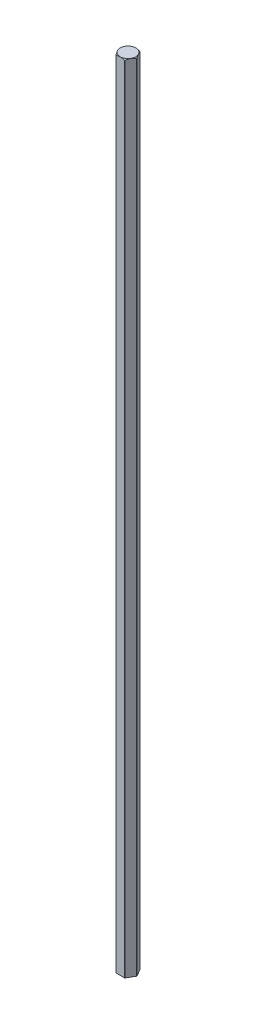
ISO-10303-21;
HEADER;
FILE_DESCRIPTION(('STEP AP214'),'2;1');
FILE_NAME('part.step','',(''),(''),'','','');
FILE_SCHEMA(('AUTOMOTIVE_DESIGN { 1 0 10303 214 1 1 1 1 }'));
ENDSEC;
DATA;
#1=APPLICATION_CONTEXT('core data for automotive mechanical design processes');
#2=APPLICATION_PROTOCOL_DEFINITION('international standard','automotive_design',2000,#1);
#3=PRODUCT_CONTEXT('',#1,'mechanical');
#4=PRODUCT('Part','Part','',(#3));
#5=PRODUCT_RELATED_PRODUCT_CATEGORY('part','',(#4));
#6=PRODUCT_DEFINITION_FORMATION('','',#4);
#7=PRODUCT_DEFINITION_CONTEXT('part definition',#1,'design');
#8=PRODUCT_DEFINITION('design','',#6,#7);
#9=PRODUCT_DEFINITION_SHAPE('','',#8);
#10=(LENGTH_UNIT() NAMED_UNIT(*) SI_UNIT(.MILLI.,.METRE.));
#11=(NAMED_UNIT(*) PLANE_ANGLE_UNIT() SI_UNIT($,.RADIAN.));
#12=(NAMED_UNIT(*) SI_UNIT($,.STERADIAN.) SOLID_ANGLE_UNIT());
#13=UNCERTAINTY_MEASURE_WITH_UNIT(LENGTH_MEASURE(1.E-05),#10,'distance_accuracy_value','');
#14=(GEOMETRIC_REPRESENTATION_CONTEXT(3) GLOBAL_UNCERTAINTY_ASSIGNED_CONTEXT((#13)) GLOBAL_UNIT_ASSIGNED_CONTEXT((#10,
#11,#12)) REPRESENTATION_CONTEXT('',''));
#15=CARTESIAN_POINT('',(0.,0.,0.));
#16=DIRECTION('',(0.,0.,1.));
#17=DIRECTION('',(1.,0.,0.));
#18=AXIS2_PLACEMENT_3D('',#15,#16,#17);
#19=CARTESIAN_POINT('',(0.,300.,0.));
#20=DIRECTION('',(0.,-1.,0.));
#21=DIRECTION('',(0.,0.,-1.));
#22=AXIS2_PLACEMENT_3D('',#19,#20,#21);
#23=CYLINDRICAL_SURFACE('',#22,4.);
#24=DIRECTION('',(0.,1.,0.));
#25=VECTOR('',#24,1.);
#26=CARTESIAN_POINT('',(2.06284307669368,300.,-3.42705098312484));
#27=LINE('',#26,#25);
#28=CARTESIAN_POINT('',(2.06284307669368,299.499999999993,-3.42705098312484));
#29=VERTEX_POINT('',#28);
#30=CARTESIAN_POINT('',(2.06284307669368,-60.,-3.42705098312484));
#31=VERTEX_POINT('',#30);
#32=EDGE_CURVE('E207',#29,#31,#27,.F.);
#33=ORIENTED_EDGE('',*,*,#32,.T.);
#34=CARTESIAN_POINT('',(0.,-60.,0.));
#35=DIRECTION('',(0.,-1.,0.));
#36=DIRECTION('',(0.,0.,-1.));
#37=AXIS2_PLACEMENT_3D('',#34,#35,#36);
#38=CIRCLE('',#37,4.);
#39=CARTESIAN_POINT('',(1.93649167310371,-60.,-3.5));
#40=VERTEX_POINT('',#39);
#41=EDGE_CURVE('E119',#31,#40,#38,.F.);
#42=ORIENTED_EDGE('',*,*,#41,.T.);
#43=DIRECTION('',(0.,1.,0.));
#44=VECTOR('',#43,1.);
#45=CARTESIAN_POINT('',(1.93649167310372,300.,-3.5));
#46=LINE('',#45,#44);
#47=CARTESIAN_POINT('',(1.93649167310371,299.499999999993,-3.5));
#48=VERTEX_POINT('',#47);
#49=EDGE_CURVE('E202',#40,#48,#46,.T.);
#50=ORIENTED_EDGE('',*,*,#49,.T.);
#51=CARTESIAN_POINT('',(0.,299.5,0.));
#52=DIRECTION('',(0.,-1.,0.));
#53=DIRECTION('',(0.,0.,-1.));
#54=AXIS2_PLACEMENT_3D('',#51,#52,#53);
#55=CIRCLE('',#54,4.);
#56=EDGE_CURVE('E213',#48,#29,#55,.T.);
#57=ORIENTED_EDGE('',*,*,#56,.T.);
#58=EDGE_LOOP('',(#33,#42,#50,#57));
#59=FACE_BOUND('',#58,.T.);
#60=ADVANCED_FACE('F34',(#59),#23,.T.);
#61=CARTESIAN_POINT('',(0.,300.,0.));
#62=DIRECTION('',(0.,-1.,0.));
#63=DIRECTION('',(0.,0.,-1.));
#64=AXIS2_PLACEMENT_3D('',#61,#62,#63);
#65=CYLINDRICAL_SURFACE('',#64,4.);
#66=DIRECTION('',(0.,1.,0.));
#67=VECTOR('',#66,1.);
#68=CARTESIAN_POINT('',(3.99933474979739,300.,0.0729490168751596));
#69=LINE('',#68,#67);
#70=CARTESIAN_POINT('',(3.99933474979739,299.499999999993,0.0729490168751595));
#71=VERTEX_POINT('',#70);
#72=CARTESIAN_POINT('',(3.99933474979739,-60.,0.0729490168751594));
#73=VERTEX_POINT('',#72);
#74=EDGE_CURVE('E199',#71,#73,#69,.F.);
#75=ORIENTED_EDGE('',*,*,#74,.T.);
#76=CARTESIAN_POINT('',(0.,-60.,0.));
#77=DIRECTION('',(0.,-1.,0.));
#78=DIRECTION('',(0.,0.,-1.));
#79=AXIS2_PLACEMENT_3D('',#76,#77,#78);
#80=CIRCLE('',#79,4.);
#81=CARTESIAN_POINT('',(3.99933474979739,-60.,-0.0729490168751625));
#82=VERTEX_POINT('',#81);
#83=EDGE_CURVE('E358',#73,#82,#80,.F.);
#84=ORIENTED_EDGE('',*,*,#83,.T.);
#85=DIRECTION('',(0.,1.,0.));
#86=VECTOR('',#85,1.);
#87=CARTESIAN_POINT('',(3.99933474979739,300.,-0.0729490168751626));
#88=LINE('',#87,#86);
#89=CARTESIAN_POINT('',(3.99933474979739,299.499999999993,-0.0729490168751625));
#90=VERTEX_POINT('',#89);
#91=EDGE_CURVE('E210',#82,#90,#88,.T.);
#92=ORIENTED_EDGE('',*,*,#91,.T.);
#93=CARTESIAN_POINT('',(0.,299.5,0.));
#94=DIRECTION('',(0.,-1.,0.));
#95=DIRECTION('',(0.,0.,-1.));
#96=AXIS2_PLACEMENT_3D('',#93,#94,#95);
#97=CIRCLE('',#96,4.);
#98=EDGE_CURVE('E112',#90,#71,#97,.T.);
#99=ORIENTED_EDGE('',*,*,#98,.T.);
#100=EDGE_LOOP('',(#75,#84,#92,#99));
#101=FACE_BOUND('',#100,.T.);
#102=ADVANCED_FACE('F350',(#101),#65,.T.);
#103=CARTESIAN_POINT('',(3.03108891324554,300.,-1.75));
#104=DIRECTION('',(-0.866025403784439,0.,0.5));
#105=DIRECTION('',(0.5,0.,0.866025403784439));
#106=AXIS2_PLACEMENT_3D('',#103,#104,#105);
#107=PLANE('',#106);
#108=DIRECTION('',(0.5,0.,0.866025403784439));
#109=VECTOR('',#108,1.);
#110=CARTESIAN_POINT('',(3.03108891324554,-60.,-1.75));
#111=LINE('',#110,#109);
#112=EDGE_CURVE('E123',#31,#82,#111,.T.);
#113=ORIENTED_EDGE('',*,*,#112,.F.);
#114=ORIENTED_EDGE('',*,*,#32,.F.);
#115=CARTESIAN_POINT('',(3.03108891325499,300.000000000047,-1.75000000000546));
#116=CARTESIAN_POINT('',(3.00421554910346,300.000004299265,-1.79654603207242));
#117=CARTESIAN_POINT('',(2.97734620720112,299.998761359263,-1.84308509740737));
#118=CARTESIAN_POINT('',(2.92366805680465,299.993821515109,-1.93605838114599));
#119=CARTESIAN_POINT('',(2.89685923949186,299.990124995184,-1.98249261482399));
#120=CARTESIAN_POINT('',(2.81669337443232,299.975434232166,-2.12134396614213));
#121=CARTESIAN_POINT('',(2.76349238274052,299.960838471884,-2.21349078676425));
#122=CARTESIAN_POINT('',(2.65868716251358,299.923095942385,-2.39501875309496));
#123=CARTESIAN_POINT('',(2.60707095569541,299.900078670629,-2.4844206457983));
#124=CARTESIAN_POINT('',(2.50481921854085,299.846495484918,-2.66152584971238));
#125=CARTESIAN_POINT('',(2.45418396722616,299.815927456268,-2.74922867764336));
#126=CARTESIAN_POINT('',(2.37504792914591,299.762545802448,-2.88629631630802));
#127=CARTESIAN_POINT('',(2.34617965449986,299.741864829476,-2.93629763472185));
#128=CARTESIAN_POINT('',(2.28881951150841,299.698548163654,-3.03564831671247));
#129=CARTESIAN_POINT('',(2.26032755204265,299.675912954389,-3.08499783811436));
#130=CARTESIAN_POINT('',(2.20345727328031,299.628670195422,-3.18350005037133));
#131=CARTESIAN_POINT('',(2.17508226603669,299.604046774544,-3.23264700458241));
#132=CARTESIAN_POINT('',(2.11869390891777,299.553187284504,-3.33031450406772));
#133=CARTESIAN_POINT('',(2.09068057527884,299.526951143245,-3.37883502121972));
#134=CARTESIAN_POINT('',(2.06284307669952,299.499999999991,-3.42705098311474));
#135=B_SPLINE_CURVE_WITH_KNOTS('',3,(#115,#116,#117,#118,#119,#120,#121,#122,#123,#124,#125,
#126,#127,#128,#129,#130,#131,#132,#133,#134),.UNSPECIFIED.,.F.,.F.,(4,2,2,2,2,2,2,2,2,4),(0.,
0.161210431686843,0.322395623883191,0.644141179030802,0.961134016721261,1.27821573346992,
1.46217088384867,1.64608064341014,1.83164013590185,2.01720792983071),.UNSPECIFIED.);
#136=CARTESIAN_POINT('',(3.03108891328354,299.999999999998,-1.75000000002194));
#137=VERTEX_POINT('',#136);
#138=EDGE_CURVE('E341',#137,#29,#135,.T.);
#139=ORIENTED_EDGE('',*,*,#138,.F.);
#140=CARTESIAN_POINT('',(3.99933474979128,299.499999999991,-0.0729490168851489));
#141=CARTESIAN_POINT('',(3.93191139913021,299.565237263727,-0.189729685847039));
#142=CARTESIAN_POINT('',(3.86337440479524,299.626424793314,-0.308439242233418));
#143=CARTESIAN_POINT('',(3.72370914437222,299.738043245625,-0.550346569338541));
#144=CARTESIAN_POINT('',(3.65256831144787,299.788410719829,-0.673566106456249));
#145=CARTESIAN_POINT('',(3.51007098432721,299.873739129642,-0.920378716971967));
#146=CARTESIAN_POINT('',(3.43877320338474,299.909082523271,-1.04387009603125));
#147=CARTESIAN_POINT('',(3.29476650379049,299.963301712474,-1.2932970163588));
#148=CARTESIAN_POINT('',(3.22206209565089,299.982223343395,-1.41922474519081));
#149=CARTESIAN_POINT('',(3.12949227031611,299.994692019499,-1.57956038591843));
#150=CARTESIAN_POINT('',(3.10986814741857,299.996676210284,-1.61355036383093));
#151=CARTESIAN_POINT('',(3.07052685521678,299.999331982927,-1.68169148075985));
#152=CARTESIAN_POINT('',(3.05080960561221,299.999998804406,-1.71584275886048));
#153=CARTESIAN_POINT('',(3.03108891324539,300.000000000042,-1.75000000000026));
#154=B_SPLINE_CURVE_WITH_KNOTS('',3,(#140,#141,#142,#143,#144,#145,#146,#147,#148,#149,#150,
#151,#152,#153),.UNSPECIFIED.,.F.,.F.,(4,2,2,2,2,2,4),(0.,0.449696577974957,0.90196223183412,
1.34190254503258,1.78061093981828,1.89849062722922,2.01679550527955),.UNSPECIFIED.);
#155=EDGE_CURVE('E320',#90,#137,#154,.T.);
#156=ORIENTED_EDGE('',*,*,#155,.F.);
#157=ORIENTED_EDGE('',*,*,#91,.F.);
#158=EDGE_LOOP('',(#113,#114,#139,#156,#157));
#159=FACE_BOUND('',#158,.T.);
#160=ADVANCED_FACE('F347',(#159),#107,.F.);
#161=CARTESIAN_POINT('',(0.,300.,-3.5));
#162=DIRECTION('',(0.,0.,1.));
#163=DIRECTION('',(1.,0.,0.));
#164=AXIS2_PLACEMENT_3D('',#161,#162,#163);
#165=PLANE('',#164);
#166=DIRECTION('',(1.,0.,0.));
#167=VECTOR('',#166,1.);
#168=CARTESIAN_POINT('',(0.,-60.,-3.5));
#169=LINE('',#168,#167);
#170=CARTESIAN_POINT('',(-1.93649167308541,-60.,-3.50000000001012));
#171=VERTEX_POINT('',#170);
#172=EDGE_CURVE('E400',#171,#40,#169,.T.);
#173=ORIENTED_EDGE('',*,*,#172,.F.);
#174=DIRECTION('',(0.,-1.,0.));
#175=VECTOR('',#174,1.);
#176=CARTESIAN_POINT('',(-1.93649167310371,300.,-3.5));
#177=LINE('',#176,#175);
#178=CARTESIAN_POINT('',(-1.93649167309489,299.500000000009,-3.5));
#179=VERTEX_POINT('',#178);
#180=EDGE_CURVE('E201',#179,#171,#177,.T.);
#181=ORIENTED_EDGE('',*,*,#180,.F.);
#182=CARTESIAN_POINT('',(0.,300.000000000047,-3.50000000001091));
#183=CARTESIAN_POINT('',(-0.0537467282911151,300.000004299265,-3.50000000000402));
#184=CARTESIAN_POINT('',(-0.10748541209073,299.998761359263,-3.5000000000011));
#185=CARTESIAN_POINT('',(-0.214841712879869,299.993821515109,-3.4999999999989));
#186=CARTESIAN_POINT('',(-0.26845934750667,299.990124995184,-3.49999999999962));
#187=CARTESIAN_POINT('',(-0.428791077627749,299.975434232166,-3.50000000000077));
#188=CARTESIAN_POINT('',(-0.535193061010368,299.960838471884,-3.5000000000002));
#189=CARTESIAN_POINT('',(-0.74480350146356,299.923095942385,-3.4999999999998));
#190=CARTESIAN_POINT('',(-0.848035915100147,299.900078670629,-3.49999999999995));
#191=CARTESIAN_POINT('',(-1.05253938940946,299.846495484918,-3.50000000000005));
#192=CARTESIAN_POINT('',(-1.15380989203877,299.815927456268,-3.50000000000001));
#193=CARTESIAN_POINT('',(-1.31208196819869,299.762545802448,-3.49999999999999));
#194=CARTESIAN_POINT('',(-1.36981851749027,299.741864829476,-3.5));
#195=CARTESIAN_POINT('',(-1.4845388034721,299.698548163655,-3.5));
#196=CARTESIAN_POINT('',(-1.54152272240309,299.67591295439,-3.5));
#197=CARTESIAN_POINT('',(-1.65526327992671,299.628670195423,-3.5));
#198=CARTESIAN_POINT('',(-1.7120132944134,299.604046774546,-3.5));
#199=CARTESIAN_POINT('',(-1.82479000865022,299.553187284506,-3.5));
#200=CARTESIAN_POINT('',(-1.88081667592759,299.526951143247,-3.5));
#201=CARTESIAN_POINT('',(-1.93649167308576,299.499999999994,-3.5));
#202=B_SPLINE_CURVE_WITH_KNOTS('',3,(#182,#183,#184,#185,#186,#187,#188,#189,#190,#191,#192,
#193,#194,#195,#196,#197,#198,#199,#200,#201),.UNSPECIFIED.,.F.,.F.,(4,2,2,2,2,2,2,2,2,4),(0.,
0.161210431686838,0.32239562388318,0.644141179030782,0.961134016721253,1.27821573346992,
1.46217088384693,1.64608064340666,1.83164013589657,2.01720792982373),.UNSPECIFIED.);
#203=CARTESIAN_POINT('',(0.,299.999999999998,-3.50000000004388));
#204=VERTEX_POINT('',#203);
#205=EDGE_CURVE('E197',#204,#179,#202,.T.);
#206=ORIENTED_EDGE('',*,*,#205,.F.);
#207=CARTESIAN_POINT('',(1.936491673092,299.499999999991,-3.4999999999997));
#208=CARTESIAN_POINT('',(1.80164497176953,299.565237263727,-3.49999999999989));
#209=CARTESIAN_POINT('',(1.66457098309946,299.626424793314,-3.49999999999997));
#210=CARTESIAN_POINT('',(1.38524046225332,299.738043245625,-3.50000000000003));
#211=CARTESIAN_POINT('',(1.24295879640465,299.788410719829,-3.50000000000001));
#212=CARTESIAN_POINT('',(0.957964142163356,299.873739129642,-3.49999999999999));
#213=CARTESIAN_POINT('',(0.815368580278413,299.909082523271,-3.5));
#214=CARTESIAN_POINT('',(0.527355181089906,299.963301712474,-3.5));
#215=CARTESIAN_POINT('',(0.381946364810705,299.982223343395,-3.5));
#216=CARTESIAN_POINT('',(0.196806714141145,299.994692019499,-3.5));
#217=CARTESIAN_POINT('',(0.157558468346075,299.996676210284,-3.5));
#218=CARTESIAN_POINT('',(0.0788758839424917,299.999331982927,-3.5));
#219=CARTESIAN_POINT('',(0.039441384733354,299.999998804406,-3.5));
#220=CARTESIAN_POINT('',(-3.03543991399146E-13,300.000000000042,-3.5));
#221=B_SPLINE_CURVE_WITH_KNOTS('',3,(#207,#208,#209,#210,#211,#212,#213,#214,#215,#216,#217,
#218,#219,#220),.UNSPECIFIED.,.F.,.F.,(4,2,2,2,2,2,4),(0.,0.449696577974957,0.901962231834121,
1.34190254503258,1.78061093981829,1.89849062722922,2.01679550527955),.UNSPECIFIED.);
#222=EDGE_CURVE('E336',#48,#204,#221,.T.);
#223=ORIENTED_EDGE('',*,*,#222,.F.);
#224=ORIENTED_EDGE('',*,*,#49,.F.);
#225=EDGE_LOOP('',(#173,#181,#206,#223,#224));
#226=FACE_BOUND('',#225,.T.);
#227=ADVANCED_FACE('F308',(#226),#165,.F.);
#228=CARTESIAN_POINT('',(3.03108891324554,300.,1.75));
#229=DIRECTION('',(-0.866025403784439,0.,-0.5));
#230=DIRECTION('',(-0.5,0.,0.866025403784439));
#231=AXIS2_PLACEMENT_3D('',#228,#229,#230);
#232=PLANE('',#231);
#233=DIRECTION('',(-0.5,0.,0.866025403784439));
#234=VECTOR('',#233,1.);
#235=CARTESIAN_POINT('',(3.03108891324554,-60.,1.75));
#236=LINE('',#235,#234);
#237=CARTESIAN_POINT('',(2.0628430766996,-60.,3.42705098312128));
#238=VERTEX_POINT('',#237);
#239=EDGE_CURVE('E365',#73,#238,#236,.T.);
#240=ORIENTED_EDGE('',*,*,#239,.F.);
#241=ORIENTED_EDGE('',*,*,#74,.F.);
#242=CARTESIAN_POINT('',(3.03108891325499,300.000000000047,1.75000000000546));
#243=CARTESIAN_POINT('',(3.05796227739458,300.000004299265,1.7034539679316));
#244=CARTESIAN_POINT('',(3.08483161929186,299.998761359263,1.65691490259374));
#245=CARTESIAN_POINT('',(3.13850976968452,299.993821515109,1.56394161885292));
#246=CARTESIAN_POINT('',(3.16531858699854,299.990124995184,1.51750738517563));
#247=CARTESIAN_POINT('',(3.24548445206008,299.975434232166,1.37865603385864));
#248=CARTESIAN_POINT('',(3.2986854437509,299.960838471884,1.28650921323596));
#249=CARTESIAN_POINT('',(3.40349066397715,299.923095942385,1.10498124690484));
#250=CARTESIAN_POINT('',(3.45510687079557,299.900078670629,1.01557935420165));
#251=CARTESIAN_POINT('',(3.55735860795031,299.846495484918,0.838474150287671));
#252=CARTESIAN_POINT('',(3.60799385926493,299.815927456268,0.750771322356651));
#253=CARTESIAN_POINT('',(3.68712989734516,299.762545802448,0.61370368369196));
#254=CARTESIAN_POINT('',(3.71599817199123,299.741864829476,0.563702365278123));
#255=CARTESIAN_POINT('',(3.77335831498268,299.698548163654,0.464351683287511));
#256=CARTESIAN_POINT('',(3.80185027444843,299.675912954389,0.415002161885634));
#257=CARTESIAN_POINT('',(3.85872055321076,299.628670195422,0.31649994962868));
#258=CARTESIAN_POINT('',(3.88709556045437,299.604046774544,0.267352995417617));
#259=CARTESIAN_POINT('',(3.94348391757329,299.553187284504,0.16968549593231));
#260=CARTESIAN_POINT('',(3.97149725121222,299.526951143245,0.121164978780297));
#261=CARTESIAN_POINT('',(3.99933474979156,299.499999999991,0.0729490168852614));
#262=B_SPLINE_CURVE_WITH_KNOTS('',3,(#242,#243,#244,#245,#246,#247,#248,#249,#250,#251,#252,
#253,#254,#255,#256,#257,#258,#259,#260,#261),.UNSPECIFIED.,.F.,.F.,(4,2,2,2,2,2,2,2,2,4),(0.,
0.161210431686841,0.322395623883186,0.644141179030802,0.961134016721262,1.27821573346992,
1.4621708838487,1.64608064341014,1.83164013590181,2.01720792983072),.UNSPECIFIED.);
#263=CARTESIAN_POINT('',(3.03108891328354,299.999999999998,1.75000000002194));
#264=VERTEX_POINT('',#263);
#265=EDGE_CURVE('E205',#264,#71,#262,.T.);
#266=ORIENTED_EDGE('',*,*,#265,.F.);
#267=CARTESIAN_POINT('',(2.06284307669927,299.499999999991,3.42705098311455));
#268=CARTESIAN_POINT('',(2.13026642736068,299.565237263727,3.31027031415286));
#269=CARTESIAN_POINT('',(2.19880342169578,299.626424793314,3.19156075776656));
#270=CARTESIAN_POINT('',(2.3384686821189,299.738043245625,2.94965343066149));
#271=CARTESIAN_POINT('',(2.40960951504322,299.788410719829,2.82643389354376));
#272=CARTESIAN_POINT('',(2.55210684216385,299.873739129642,2.57962128302803));
#273=CARTESIAN_POINT('',(2.62340462310633,299.909082523271,2.45612990396875));
#274=CARTESIAN_POINT('',(2.76741132270058,299.963301712474,2.2067029836412));
#275=CARTESIAN_POINT('',(2.84011573084018,299.982223343395,2.08077525480919));
#276=CARTESIAN_POINT('',(2.93268555617496,299.994692019499,1.92043961408157));
#277=CARTESIAN_POINT('',(2.9523096790725,299.996676210284,1.88644963616907));
#278=CARTESIAN_POINT('',(2.99165097127429,299.999331982927,1.81830851924015));
#279=CARTESIAN_POINT('',(3.01136822087886,299.999998804406,1.78415724113952));
#280=CARTESIAN_POINT('',(3.03108891324569,300.000000000042,1.74999999999974));
#281=B_SPLINE_CURVE_WITH_KNOTS('',3,(#267,#268,#269,#270,#271,#272,#273,#274,#275,#276,#277,
#278,#279,#280),.UNSPECIFIED.,.F.,.F.,(4,2,2,2,2,2,4),(0.,0.449696577974956,0.901962231834119,
1.34190254503258,1.78061093981828,1.89849062722922,2.01679550527955),.UNSPECIFIED.);
#282=CARTESIAN_POINT('',(2.06284307669659,299.499999999996,3.4270509831198));
#283=VERTEX_POINT('',#282);
#284=EDGE_CURVE('E196',#283,#264,#281,.T.);
#285=ORIENTED_EDGE('',*,*,#284,.F.);
#286=DIRECTION('',(0.,-1.,0.));
#287=VECTOR('',#286,1.);
#288=CARTESIAN_POINT('',(2.06284307669368,300.,3.42705098312484));
#289=LINE('',#288,#287);
#290=EDGE_CURVE('E192',#238,#283,#289,.F.);
#291=ORIENTED_EDGE('',*,*,#290,.F.);
#292=EDGE_LOOP('',(#240,#241,#266,#285,#291));
#293=FACE_BOUND('',#292,.T.);
#294=ADVANCED_FACE('F303',(#293),#232,.F.);
#295=CARTESIAN_POINT('',(0.,300.,0.));
#296=DIRECTION('',(0.,-1.,0.));
#297=DIRECTION('',(0.,0.,-1.));
#298=AXIS2_PLACEMENT_3D('',#295,#296,#297);
#299=CYLINDRICAL_SURFACE('',#298,4.);
#300=ORIENTED_EDGE('',*,*,#180,.T.);
#301=CARTESIAN_POINT('',(0.,-60.,0.));
#302=DIRECTION('',(0.,-1.,0.));
#303=DIRECTION('',(0.,0.,-1.));
#304=AXIS2_PLACEMENT_3D('',#301,#302,#303);
#305=CIRCLE('',#304,4.);
#306=CARTESIAN_POINT('',(-2.06284307671317,-60.,-3.42705098309109));
#307=VERTEX_POINT('',#306);
#308=EDGE_CURVE('E394',#171,#307,#305,.F.);
#309=ORIENTED_EDGE('',*,*,#308,.T.);
#310=DIRECTION('',(0.,1.,0.));
#311=VECTOR('',#310,1.);
#312=CARTESIAN_POINT('',(-2.06284307669368,300.,-3.42705098312485));
#313=LINE('',#312,#311);
#314=CARTESIAN_POINT('',(-2.06284307671317,299.500000000023,-3.42705098309109));
#315=VERTEX_POINT('',#314);
#316=EDGE_CURVE('E187',#307,#315,#313,.T.);
#317=ORIENTED_EDGE('',*,*,#316,.T.);
#318=CARTESIAN_POINT('',(0.,299.500000000023,0.));
#319=DIRECTION('',(0.,-1.,0.));
#320=DIRECTION('',(0.,0.,-1.));
#321=AXIS2_PLACEMENT_3D('',#318,#319,#320);
#322=CIRCLE('',#321,3.99999999996226);
#323=EDGE_CURVE('E193',#179,#315,#322,.F.);
#324=ORIENTED_EDGE('',*,*,#323,.F.);
#325=EDGE_LOOP('',(#300,#309,#317,#324));
#326=FACE_BOUND('',#325,.T.);
#327=ADVANCED_FACE('F307',(#326),#299,.T.);
#328=CARTESIAN_POINT('',(0.,300.,0.));
#329=DIRECTION('',(0.,-1.,0.));
#330=DIRECTION('',(0.,0.,-1.));
#331=AXIS2_PLACEMENT_3D('',#328,#329,#330);
#332=CYLINDRICAL_SURFACE('',#331,4.);
#333=DIRECTION('',(0.,1.,0.));
#334=VECTOR('',#333,1.);
#335=CARTESIAN_POINT('',(1.93649167310371,300.,3.5));
#336=LINE('',#335,#334);
#337=CARTESIAN_POINT('',(1.93649167310371,299.499999999993,3.5));
#338=VERTEX_POINT('',#337);
#339=CARTESIAN_POINT('',(1.93649167310371,-60.,3.5));
#340=VERTEX_POINT('',#339);
#341=EDGE_CURVE('E182',#338,#340,#336,.F.);
#342=ORIENTED_EDGE('',*,*,#341,.T.);
#343=CARTESIAN_POINT('',(0.,-60.,0.));
#344=DIRECTION('',(0.,-1.,0.));
#345=DIRECTION('',(0.,0.,-1.));
#346=AXIS2_PLACEMENT_3D('',#343,#344,#345);
#347=CIRCLE('',#346,4.);
#348=EDGE_CURVE('E391',#340,#238,#347,.F.);
#349=ORIENTED_EDGE('',*,*,#348,.T.);
#350=ORIENTED_EDGE('',*,*,#290,.T.);
#351=CARTESIAN_POINT('',(0.,299.5,0.));
#352=DIRECTION('',(0.,-1.,0.));
#353=DIRECTION('',(0.,0.,-1.));
#354=AXIS2_PLACEMENT_3D('',#351,#352,#353);
#355=CIRCLE('',#354,4.);
#356=EDGE_CURVE('E190',#283,#338,#355,.T.);
#357=ORIENTED_EDGE('',*,*,#356,.T.);
#358=EDGE_LOOP('',(#342,#349,#350,#357));
#359=FACE_BOUND('',#358,.T.);
#360=ADVANCED_FACE('F280',(#359),#332,.T.);
#361=CARTESIAN_POINT('',(-3.03108891324554,300.,-1.75));
#362=DIRECTION('',(0.866025403784439,0.,0.5));
#363=DIRECTION('',(0.5,0.,-0.866025403784439));
#364=AXIS2_PLACEMENT_3D('',#361,#362,#363);
#365=PLANE('',#364);
#366=DIRECTION('',(0.5,0.,-0.866025403784439));
#367=VECTOR('',#366,1.);
#368=CARTESIAN_POINT('',(-3.03108891324554,-60.,-1.75));
#369=LINE('',#368,#367);
#370=CARTESIAN_POINT('',(-3.99933474979726,-60.,-0.0729490168820639));
#371=VERTEX_POINT('',#370);
#372=EDGE_CURVE('E389',#371,#307,#369,.T.);
#373=ORIENTED_EDGE('',*,*,#372,.F.);
#374=DIRECTION('',(0.,-1.,0.));
#375=VECTOR('',#374,1.);
#376=CARTESIAN_POINT('',(-3.99933474979739,300.,-0.0729490168751604));
#377=LINE('',#376,#375);
#378=CARTESIAN_POINT('',(-3.99933474979241,299.500000000009,-0.0729490168837852));
#379=VERTEX_POINT('',#378);
#380=EDGE_CURVE('E160',#379,#371,#377,.T.);
#381=ORIENTED_EDGE('',*,*,#380,.F.);
#382=CARTESIAN_POINT('',(-3.03108891325292,300.000000000046,-1.75000000000426));
#383=CARTESIAN_POINT('',(-3.05796227739383,300.000004299264,-1.70345396793114));
#384=CARTESIAN_POINT('',(-3.08483161929167,299.998761359263,-1.65691490259357));
#385=CARTESIAN_POINT('',(-3.13850976968477,299.993821515109,-1.56394161885297));
#386=CARTESIAN_POINT('',(-3.16531858699866,299.990124995184,-1.5175073851756));
#387=CARTESIAN_POINT('',(-3.24548445205998,299.975434232166,-1.37865603385847));
#388=CARTESIAN_POINT('',(-3.29868544375091,299.960838471884,-1.28650921323586));
#389=CARTESIAN_POINT('',(-3.40349066397723,299.923095942385,-1.10498124690479));
#390=CARTESIAN_POINT('',(-3.45510687079562,299.900078670629,-1.01557935420159));
#391=CARTESIAN_POINT('',(-3.55735860795033,299.846495484918,-0.838474150287612));
#392=CARTESIAN_POINT('',(-3.60799385926495,299.815927456268,-0.750771322356605));
#393=CARTESIAN_POINT('',(-3.68712989734481,299.762545802448,-0.61370368369256));
#394=CARTESIAN_POINT('',(-3.71599817199052,299.741864829476,-0.563702365279355));
#395=CARTESIAN_POINT('',(-3.77335831498125,299.698548163655,-0.464351683289995));
#396=CARTESIAN_POINT('',(-3.80185027444664,299.67591295439,-0.415002161888737));
#397=CARTESIAN_POINT('',(-3.85872055320825,299.628670195424,-0.316499949633018));
#398=CARTESIAN_POINT('',(-3.88709556045151,299.604046774546,-0.26735299542257));
#399=CARTESIAN_POINT('',(-3.94348391756973,299.553187284507,-0.169685495938467));
#400=CARTESIAN_POINT('',(-3.97149725120833,299.526951143248,-0.121164978787042));
#401=CARTESIAN_POINT('',(-3.99933474978733,299.499999999995,-0.0729490168925828));
#402=B_SPLINE_CURVE_WITH_KNOTS('',3,(#382,#383,#384,#385,#386,#387,#388,#389,#390,#391,#392,
#393,#394,#395,#396,#397,#398,#399,#400,#401),.UNSPECIFIED.,.F.,.F.,(4,2,2,2,2,2,2,2,2,4),(0.,
0.161210431686893,0.322395623883262,0.644141179030868,0.961134016721305,1.27821573346996,
1.46217088384641,1.64608064340547,1.83164013589475,2.0172079298213),.UNSPECIFIED.);
#403=CARTESIAN_POINT('',(-3.03108891328354,299.999999999998,-1.75000000002194));
#404=VERTEX_POINT('',#403);
#405=EDGE_CURVE('E179',#404,#379,#402,.T.);
#406=ORIENTED_EDGE('',*,*,#405,.F.);
#407=CARTESIAN_POINT('',(-2.06284307669772,299.49999999999,-3.42705098311314));
#408=CARTESIAN_POINT('',(-2.1302664273601,299.565237263726,-3.31027031415238));
#409=CARTESIAN_POINT('',(-2.19880342169558,299.626424793314,-3.1915607577665));
#410=CARTESIAN_POINT('',(-2.33846868211893,299.738043245625,-2.94965343066183));
#411=CARTESIAN_POINT('',(-2.4096095150431,299.788410719829,-2.82643389354406));
#412=CARTESIAN_POINT('',(-2.55210684216357,299.873739129642,-2.57962128302842));
#413=CARTESIAN_POINT('',(-2.62340462310602,299.909082523271,-2.45612990396926));
#414=CARTESIAN_POINT('',(-2.7674113227002,299.963301712474,-2.2067029836419));
#415=CARTESIAN_POINT('',(-2.84011573083974,299.982223343395,-2.08077525480996));
#416=CARTESIAN_POINT('',(-2.93268555617455,299.994692019498,-1.92043961408229));
#417=CARTESIAN_POINT('',(-2.95230967907216,299.996676210283,-1.88644963616966));
#418=CARTESIAN_POINT('',(-2.9916509712741,299.999331982927,-1.81830851924047));
#419=CARTESIAN_POINT('',(-3.01136822087875,299.999998804406,-1.78415724113971));
#420=CARTESIAN_POINT('',(-3.03108891324566,300.000000000042,-1.74999999999979));
#421=B_SPLINE_CURVE_WITH_KNOTS('',3,(#407,#408,#409,#410,#411,#412,#413,#414,#415,#416,#417,
#418,#419,#420),.UNSPECIFIED.,.F.,.F.,(4,2,2,2,2,2,4),(0.,0.449696577974741,0.901962231833673,
1.34190254503183,1.78061093981726,1.89849062722865,2.01679550527944),.UNSPECIFIED.);
#422=EDGE_CURVE('E189',#315,#404,#421,.T.);
#423=ORIENTED_EDGE('',*,*,#422,.F.);
#424=ORIENTED_EDGE('',*,*,#316,.F.);
#425=EDGE_LOOP('',(#373,#381,#406,#423,#424));
#426=FACE_BOUND('',#425,.T.);
#427=ADVANCED_FACE('F254',(#426),#365,.F.);
#428=CARTESIAN_POINT('',(0.,300.,3.5));
#429=DIRECTION('',(0.,0.,-1.));
#430=DIRECTION('',(-1.,0.,0.));
#431=AXIS2_PLACEMENT_3D('',#428,#429,#430);
#432=PLANE('',#431);
#433=DIRECTION('',(-1.,0.,0.));
#434=VECTOR('',#433,1.);
#435=CARTESIAN_POINT('',(0.,-60.,3.5));
#436=LINE('',#435,#434);
#437=CARTESIAN_POINT('',(-1.93649167309767,-60.,3.50000000000334));
#438=VERTEX_POINT('',#437);
#439=EDGE_CURVE('E161',#340,#438,#436,.T.);
#440=ORIENTED_EDGE('',*,*,#439,.F.);
#441=ORIENTED_EDGE('',*,*,#341,.F.);
#442=CARTESIAN_POINT('',(0.,300.000000000046,3.50000000000852));
#443=CARTESIAN_POINT('',(0.0537467282911487,300.000004299264,3.50000000000314));
#444=CARTESIAN_POINT('',(0.107485412090789,299.998761359263,3.50000000000086));
#445=CARTESIAN_POINT('',(0.214841712879962,299.993821515109,3.49999999999914));
#446=CARTESIAN_POINT('',(0.268459347506773,299.990124995184,3.4999999999997));
#447=CARTESIAN_POINT('',(0.428791077627861,299.975434232166,3.5000000000006));
#448=CARTESIAN_POINT('',(0.535193061010482,299.960838471884,3.50000000000016));
#449=CARTESIAN_POINT('',(0.744803501463666,299.923095942385,3.49999999999984));
#450=CARTESIAN_POINT('',(0.848035915100243,299.900078670629,3.49999999999996));
#451=CARTESIAN_POINT('',(1.05253938940952,299.846495484918,3.50000000000004));
#452=CARTESIAN_POINT('',(1.15380989203882,299.815927456268,3.50000000000001));
#453=CARTESIAN_POINT('',(1.31208196819981,299.762545802447,3.49999999999999));
#454=CARTESIAN_POINT('',(1.36981851749245,299.741864829476,3.5));
#455=CARTESIAN_POINT('',(1.48453880347637,299.698548163653,3.5));
#456=CARTESIAN_POINT('',(1.54152272240838,299.675912954388,3.5));
#457=CARTESIAN_POINT('',(1.65526327993403,299.62867019542,3.5));
#458=CARTESIAN_POINT('',(1.71201329442173,299.604046774542,3.5));
#459=CARTESIAN_POINT('',(1.82479000866054,299.553187284501,3.5));
#460=CARTESIAN_POINT('',(1.88081667593889,299.526951143242,3.5));
#461=CARTESIAN_POINT('',(1.93649167309804,299.499999999988,3.5));
#462=B_SPLINE_CURVE_WITH_KNOTS('',3,(#442,#443,#444,#445,#446,#447,#448,#449,#450,#451,#452,
#453,#454,#455,#456,#457,#458,#459,#460,#461),.UNSPECIFIED.,.F.,.F.,(4,2,2,2,2,2,2,2,2,4),(0.,
0.161210431686897,0.32239562388327,0.644141179030877,0.961134016721308,1.27821573346996,
1.46217088385037,1.64608064341345,1.83164013590679,2.01720792983735),.UNSPECIFIED.);
#463=CARTESIAN_POINT('',(0.,299.999999999998,3.50000000004388));
#464=VERTEX_POINT('',#463);
#465=EDGE_CURVE('E185',#464,#338,#462,.T.);
#466=ORIENTED_EDGE('',*,*,#465,.F.);
#467=CARTESIAN_POINT('',(-1.936491673092,299.499999999991,3.4999999999997));
#468=CARTESIAN_POINT('',(-1.80164497176951,299.565237263727,3.49999999999989));
#469=CARTESIAN_POINT('',(-1.66457098309945,299.626424793314,3.49999999999997));
#470=CARTESIAN_POINT('',(-1.38524046225332,299.738043245625,3.50000000000003));
#471=CARTESIAN_POINT('',(-1.24295879640465,299.788410719829,3.50000000000001));
#472=CARTESIAN_POINT('',(-0.957964142163354,299.873739129643,3.49999999999999));
#473=CARTESIAN_POINT('',(-0.815368580278402,299.909082523271,3.5));
#474=CARTESIAN_POINT('',(-0.527355181089892,299.963301712474,3.5));
#475=CARTESIAN_POINT('',(-0.381946364810697,299.982223343395,3.5));
#476=CARTESIAN_POINT('',(-0.196806714141153,299.994692019499,3.5));
#477=CARTESIAN_POINT('',(-0.157558468346094,299.996676210284,3.5));
#478=CARTESIAN_POINT('',(-0.0788758839425324,299.999331982927,3.5));
#479=CARTESIAN_POINT('',(-0.0394413847334057,299.999998804406,3.5));
#480=CARTESIAN_POINT('',(2.40479872516161E-13,300.000000000042,3.5));
#481=B_SPLINE_CURVE_WITH_KNOTS('',3,(#467,#468,#469,#470,#471,#472,#473,#474,#475,#476,#477,
#478,#479,#480),.UNSPECIFIED.,.F.,.F.,(4,2,2,2,2,2,4),(0.,0.449696577974964,0.901962231834137,
1.34190254503259,1.78061093981829,1.89849062722919,2.01679550527949),.UNSPECIFIED.);
#482=CARTESIAN_POINT('',(-1.93649167309789,299.499999999996,3.5));
#483=VERTEX_POINT('',#482);
#484=EDGE_CURVE('E241',#483,#464,#481,.T.);
#485=ORIENTED_EDGE('',*,*,#484,.F.);
#486=DIRECTION('',(0.,-1.,0.));
#487=VECTOR('',#486,1.);
#488=CARTESIAN_POINT('',(-1.93649167310371,300.,3.5));
#489=LINE('',#488,#487);
#490=EDGE_CURVE('E171',#438,#483,#489,.F.);
#491=ORIENTED_EDGE('',*,*,#490,.F.);
#492=EDGE_LOOP('',(#440,#441,#466,#485,#491));
#493=FACE_BOUND('',#492,.T.);
#494=ADVANCED_FACE('F250',(#493),#432,.F.);
#495=CARTESIAN_POINT('',(0.,300.,0.));
#496=DIRECTION('',(0.,-1.,0.));
#497=DIRECTION('',(0.,0.,-1.));
#498=AXIS2_PLACEMENT_3D('',#495,#496,#497);
#499=CYLINDRICAL_SURFACE('',#498,4.);
#500=ORIENTED_EDGE('',*,*,#380,.T.);
#501=CARTESIAN_POINT('',(0.,-60.,0.));
#502=DIRECTION('',(0.,-1.,0.));
#503=DIRECTION('',(0.,0.,-1.));
#504=AXIS2_PLACEMENT_3D('',#501,#502,#503);
#505=CIRCLE('',#504,4.);
#506=CARTESIAN_POINT('',(-3.99933474979739,-60.,0.0729490168751524));
#507=VERTEX_POINT('',#506);
#508=EDGE_CURVE('E149',#371,#507,#505,.F.);
#509=ORIENTED_EDGE('',*,*,#508,.T.);
#510=DIRECTION('',(0.,1.,0.));
#511=VECTOR('',#510,1.);
#512=CARTESIAN_POINT('',(-3.99933474979739,300.,0.0729490168751492));
#513=LINE('',#512,#511);
#514=CARTESIAN_POINT('',(-3.9993347497779,299.500000000023,0.0729490169089114));
#515=VERTEX_POINT('',#514);
#516=EDGE_CURVE('E157',#507,#515,#513,.T.);
#517=ORIENTED_EDGE('',*,*,#516,.T.);
#518=CARTESIAN_POINT('',(0.,299.500000000023,0.));
#519=DIRECTION('',(0.,-1.,0.));
#520=DIRECTION('',(0.,0.,-1.));
#521=AXIS2_PLACEMENT_3D('',#518,#519,#520);
#522=CIRCLE('',#521,3.99999999996226);
#523=EDGE_CURVE('E176',#379,#515,#522,.F.);
#524=ORIENTED_EDGE('',*,*,#523,.F.);
#525=EDGE_LOOP('',(#500,#509,#517,#524));
#526=FACE_BOUND('',#525,.T.);
#527=ADVANCED_FACE('F155',(#526),#499,.T.);
#528=CARTESIAN_POINT('',(0.,300.,0.));
#529=DIRECTION('',(0.,-1.,0.));
#530=DIRECTION('',(0.,0.,-1.));
#531=AXIS2_PLACEMENT_3D('',#528,#529,#530);
#532=CYLINDRICAL_SURFACE('',#531,4.);
#533=DIRECTION('',(0.,1.,0.));
#534=VECTOR('',#533,1.);
#535=CARTESIAN_POINT('',(-2.06284307669368,300.,3.42705098312484));
#536=LINE('',#535,#534);
#537=CARTESIAN_POINT('',(-2.06284307669368,299.499999999993,3.42705098312484));
#538=VERTEX_POINT('',#537);
#539=CARTESIAN_POINT('',(-2.06284307669368,-60.,3.42705098312484));
#540=VERTEX_POINT('',#539);
#541=EDGE_CURVE('E41',#538,#540,#536,.F.);
#542=ORIENTED_EDGE('',*,*,#541,.T.);
#543=CARTESIAN_POINT('',(0.,-60.,0.));
#544=DIRECTION('',(0.,-1.,0.));
#545=DIRECTION('',(0.,0.,-1.));
#546=AXIS2_PLACEMENT_3D('',#543,#544,#545);
#547=CIRCLE('',#546,4.);
#548=EDGE_CURVE('E47',#540,#438,#547,.F.);
#549=ORIENTED_EDGE('',*,*,#548,.T.);
#550=ORIENTED_EDGE('',*,*,#490,.T.);
#551=CARTESIAN_POINT('',(0.,299.5,0.));
#552=DIRECTION('',(0.,-1.,0.));
#553=DIRECTION('',(0.,0.,-1.));
#554=AXIS2_PLACEMENT_3D('',#551,#552,#553);
#555=CIRCLE('',#554,4.);
#556=EDGE_CURVE('E56',#483,#538,#555,.T.);
#557=ORIENTED_EDGE('',*,*,#556,.T.);
#558=EDGE_LOOP('',(#542,#549,#550,#557));
#559=FACE_BOUND('',#558,.T.);
#560=ADVANCED_FACE('F236',(#559),#532,.T.);
#561=CARTESIAN_POINT('',(-3.03108891324554,300.,1.75));
#562=DIRECTION('',(0.866025403784439,0.,-0.5));
#563=DIRECTION('',(-0.5,0.,-0.866025403784439));
#564=AXIS2_PLACEMENT_3D('',#561,#562,#563);
#565=PLANE('',#564);
#566=DIRECTION('',(-0.5,0.,-0.866025403784439));
#567=VECTOR('',#566,1.);
#568=CARTESIAN_POINT('',(-3.03108891324554,-60.,1.75));
#569=LINE('',#568,#567);
#570=EDGE_CURVE('E11',#540,#507,#569,.T.);
#571=ORIENTED_EDGE('',*,*,#570,.F.);
#572=ORIENTED_EDGE('',*,*,#541,.F.);
#573=CARTESIAN_POINT('',(-3.03108891325085,300.000000000045,1.75000000000307));
#574=CARTESIAN_POINT('',(-3.0042155491019,300.000004299264,1.79654603207159));
#575=CARTESIAN_POINT('',(-2.97734620720065,299.998761359263,1.84308509740722));
#576=CARTESIAN_POINT('',(-2.92366805680497,299.993821515109,1.93605838114637));
#577=CARTESIAN_POINT('',(-2.89685923949191,299.990124995184,1.98249261482423));
#578=CARTESIAN_POINT('',(-2.81669337443192,299.975434232166,2.12134396614214));
#579=CARTESIAN_POINT('',(-2.76349238274033,299.960838471884,2.21349078676439));
#580=CARTESIAN_POINT('',(-2.65868716251355,299.923095942385,2.39501875309518));
#581=CARTESIAN_POINT('',(-2.60707095569534,299.900078670629,2.48442064579846));
#582=CARTESIAN_POINT('',(-2.50481921854076,299.846495484918,2.66152584971249));
#583=CARTESIAN_POINT('',(-2.4541839672261,299.815927456268,2.74922867764346));
#584=CARTESIAN_POINT('',(-2.37504792914561,299.762545802447,2.88629631630856));
#585=CARTESIAN_POINT('',(-2.34617965449929,299.741864829476,2.93629763472283));
#586=CARTESIAN_POINT('',(-2.28881951150735,299.698548163653,3.0356483167143));
#587=CARTESIAN_POINT('',(-2.26032755204135,299.675912954388,3.0849978381166));
#588=CARTESIAN_POINT('',(-2.20345727327852,299.62867019542,3.18350005037442));
#589=CARTESIAN_POINT('',(-2.17508226603466,299.604046774542,3.23264700458593));
#590=CARTESIAN_POINT('',(-2.11869390891525,299.553187284501,3.33031450407208));
#591=CARTESIAN_POINT('',(-2.09068057527608,299.526951143242,3.3788350212245));
#592=CARTESIAN_POINT('',(-2.06284307669652,299.499999999988,3.42705098311993));
#593=B_SPLINE_CURVE_WITH_KNOTS('',3,(#573,#574,#575,#576,#577,#578,#579,#580,#581,#582,#583,
#584,#585,#586,#587,#588,#589,#590,#591,#592),.UNSPECIFIED.,.F.,.F.,(4,2,2,2,2,2,2,2,2,4),(0.,
0.16121043168695,0.322395623883356,0.644141179030984,0.961134016721378,1.27821573346998,
1.46217088385035,1.64608064341341,1.83164013590679,2.01720792983732),.UNSPECIFIED.);
#594=CARTESIAN_POINT('',(-3.03108891328354,299.999999999998,1.75000000002194));
#595=VERTEX_POINT('',#594);
#596=EDGE_CURVE('E169',#595,#538,#593,.T.);
#597=ORIENTED_EDGE('',*,*,#596,.F.);
#598=CARTESIAN_POINT('',(-3.99933474978927,299.49999999999,0.0729490168844997));
#599=CARTESIAN_POINT('',(-3.93191139912951,299.565237263726,0.189729685846766));
#600=CARTESIAN_POINT('',(-3.8633744047951,299.626424793314,0.308439242233266));
#601=CARTESIAN_POINT('',(-3.72370914437253,299.738043245625,0.550346569338398));
#602=CARTESIAN_POINT('',(-3.65256831144807,299.788410719829,0.673566106455993));
#603=CARTESIAN_POINT('',(-3.5100709843274,299.873739129642,0.920378716971528));
#604=CARTESIAN_POINT('',(-3.43877320338502,299.909082523271,1.04387009603074));
#605=CARTESIAN_POINT('',(-3.29476650379089,299.963301712474,1.29329701635813));
#606=CARTESIAN_POINT('',(-3.22206209565133,299.982223343395,1.41922474519005));
#607=CARTESIAN_POINT('',(-3.12949227031653,299.994692019498,1.57956038591769));
#608=CARTESIAN_POINT('',(-3.10986814741892,299.996676210283,1.61355036383032));
#609=CARTESIAN_POINT('',(-3.07052685521699,299.999331982927,1.68169148075949));
#610=CARTESIAN_POINT('',(-3.05080960561235,299.999998804406,1.71584275886024));
#611=CARTESIAN_POINT('',(-3.03108891324545,300.000000000042,1.75000000000015));
#612=B_SPLINE_CURVE_WITH_KNOTS('',3,(#598,#599,#600,#601,#602,#603,#604,#605,#606,#607,#608,
#609,#610,#611),.UNSPECIFIED.,.F.,.F.,(4,2,2,2,2,2,4),(0.,0.44969657797474,0.901962231833673,
1.34190254503185,1.78061093981726,1.89849062722861,2.01679550527938),.UNSPECIFIED.);
#613=EDGE_CURVE('E167',#515,#595,#612,.T.);
#614=ORIENTED_EDGE('',*,*,#613,.F.);
#615=ORIENTED_EDGE('',*,*,#516,.F.);
#616=EDGE_LOOP('',(#571,#572,#597,#614,#615));
#617=FACE_BOUND('',#616,.T.);
#618=ADVANCED_FACE('F164',(#617),#565,.F.);
#619=CARTESIAN_POINT('',(0.,299.500000000023,0.));
#620=DIRECTION('',(0.,-1.,0.));
#621=DIRECTION('',(0.,0.,-1.));
#622=AXIS2_PLACEMENT_3D('',#619,#620,#621);
#623=CONICAL_SURFACE('',#622,3.99999999996226,0.785398163340605);
#624=ORIENTED_EDGE('',*,*,#155,.T.);
#625=CARTESIAN_POINT('',(0.,299.999999999955,0.));
#626=DIRECTION('',(0.,-1.,0.));
#627=DIRECTION('',(0.,0.,-1.));
#628=AXIS2_PLACEMENT_3D('',#625,#626,#627);
#629=CIRCLE('',#628,3.50000000008777);
#630=EDGE_CURVE('E368',#264,#137,#629,.F.);
#631=ORIENTED_EDGE('',*,*,#630,.F.);
#632=ORIENTED_EDGE('',*,*,#265,.T.);
#633=ORIENTED_EDGE('',*,*,#98,.F.);
#634=EDGE_LOOP('',(#624,#631,#632,#633));
#635=FACE_BOUND('',#634,.T.);
#636=ADVANCED_FACE('F326',(#635),#623,.T.);
#637=CARTESIAN_POINT('',(0.,299.500000000023,0.));
#638=DIRECTION('',(0.,-1.,0.));
#639=DIRECTION('',(0.,0.,-1.));
#640=AXIS2_PLACEMENT_3D('',#637,#638,#639);
#641=CONICAL_SURFACE('',#640,3.99999999996226,0.785398163340605);
#642=ORIENTED_EDGE('',*,*,#222,.T.);
#643=CARTESIAN_POINT('',(0.,299.999999999955,0.));
#644=DIRECTION('',(0.,-1.,0.));
#645=DIRECTION('',(0.,0.,-1.));
#646=AXIS2_PLACEMENT_3D('',#643,#644,#645);
#647=CIRCLE('',#646,3.50000000008777);
#648=EDGE_CURVE('E373',#137,#204,#647,.F.);
#649=ORIENTED_EDGE('',*,*,#648,.F.);
#650=ORIENTED_EDGE('',*,*,#138,.T.);
#651=ORIENTED_EDGE('',*,*,#56,.F.);
#652=EDGE_LOOP('',(#642,#649,#650,#651));
#653=FACE_BOUND('',#652,.T.);
#654=ADVANCED_FACE('F329',(#653),#641,.T.);
#655=CARTESIAN_POINT('',(0.,299.500000000023,0.));
#656=DIRECTION('',(0.,-1.,0.));
#657=DIRECTION('',(0.,0.,-1.));
#658=AXIS2_PLACEMENT_3D('',#655,#656,#657);
#659=CONICAL_SURFACE('',#658,3.99999999996226,0.785398163340605);
#660=ORIENTED_EDGE('',*,*,#422,.T.);
#661=CARTESIAN_POINT('',(0.,299.999999999955,0.));
#662=DIRECTION('',(0.,-1.,0.));
#663=DIRECTION('',(0.,0.,-1.));
#664=AXIS2_PLACEMENT_3D('',#661,#662,#663);
#665=CIRCLE('',#664,3.50000000008777);
#666=EDGE_CURVE('E267',#204,#404,#665,.F.);
#667=ORIENTED_EDGE('',*,*,#666,.F.);
#668=ORIENTED_EDGE('',*,*,#205,.T.);
#669=ORIENTED_EDGE('',*,*,#323,.T.);
#670=EDGE_LOOP('',(#660,#667,#668,#669));
#671=FACE_BOUND('',#670,.T.);
#672=ADVANCED_FACE('F278',(#671),#659,.T.);
#673=CARTESIAN_POINT('',(0.,299.500000000023,0.));
#674=DIRECTION('',(0.,-1.,0.));
#675=DIRECTION('',(0.,0.,-1.));
#676=AXIS2_PLACEMENT_3D('',#673,#674,#675);
#677=CONICAL_SURFACE('',#676,3.99999999996226,0.785398163340605);
#678=ORIENTED_EDGE('',*,*,#284,.T.);
#679=CARTESIAN_POINT('',(0.,299.999999999955,0.));
#680=DIRECTION('',(0.,-1.,0.));
#681=DIRECTION('',(0.,0.,-1.));
#682=AXIS2_PLACEMENT_3D('',#679,#680,#681);
#683=CIRCLE('',#682,3.50000000008777);
#684=EDGE_CURVE('E374',#464,#264,#683,.F.);
#685=ORIENTED_EDGE('',*,*,#684,.F.);
#686=ORIENTED_EDGE('',*,*,#465,.T.);
#687=ORIENTED_EDGE('',*,*,#356,.F.);
#688=EDGE_LOOP('',(#678,#685,#686,#687));
#689=FACE_BOUND('',#688,.T.);
#690=ADVANCED_FACE('F273',(#689),#677,.T.);
#691=CARTESIAN_POINT('',(0.,300.,0.));
#692=DIRECTION('',(0.,1.,0.));
#693=DIRECTION('',(0.,0.,1.));
#694=AXIS2_PLACEMENT_3D('',#691,#692,#693);
#695=PLANE('',#694);
#696=ORIENTED_EDGE('',*,*,#666,.T.);
#697=CARTESIAN_POINT('',(0.,299.999999999955,0.));
#698=DIRECTION('',(0.,-1.,0.));
#699=DIRECTION('',(0.,0.,-1.));
#700=AXIS2_PLACEMENT_3D('',#697,#698,#699);
#701=CIRCLE('',#700,3.50000000008777);
#702=EDGE_CURVE('E178',#595,#404,#701,.T.);
#703=ORIENTED_EDGE('',*,*,#702,.F.);
#704=CARTESIAN_POINT('',(0.,299.999999999955,0.));
#705=DIRECTION('',(0.,-1.,0.));
#706=DIRECTION('',(0.,0.,-1.));
#707=AXIS2_PLACEMENT_3D('',#704,#705,#706);
#708=CIRCLE('',#707,3.50000000008777);
#709=EDGE_CURVE('E181',#464,#595,#708,.T.);
#710=ORIENTED_EDGE('',*,*,#709,.F.);
#711=ORIENTED_EDGE('',*,*,#684,.T.);
#712=ORIENTED_EDGE('',*,*,#630,.T.);
#713=ORIENTED_EDGE('',*,*,#648,.T.);
#714=EDGE_LOOP('',(#696,#703,#710,#711,#712,#713));
#715=FACE_BOUND('',#714,.T.);
#716=ADVANCED_FACE('F256',(#715),#695,.T.);
#717=CARTESIAN_POINT('',(0.,299.500000000023,0.));
#718=DIRECTION('',(0.,-1.,0.));
#719=DIRECTION('',(0.,0.,-1.));
#720=AXIS2_PLACEMENT_3D('',#717,#718,#719);
#721=CONICAL_SURFACE('',#720,3.99999999996226,0.785398163340605);
#722=ORIENTED_EDGE('',*,*,#613,.T.);
#723=ORIENTED_EDGE('',*,*,#702,.T.);
#724=ORIENTED_EDGE('',*,*,#405,.T.);
#725=ORIENTED_EDGE('',*,*,#523,.T.);
#726=EDGE_LOOP('',(#722,#723,#724,#725));
#727=FACE_BOUND('',#726,.T.);
#728=ADVANCED_FACE('F234',(#727),#721,.T.);
#729=CARTESIAN_POINT('',(0.,299.500000000023,0.));
#730=DIRECTION('',(0.,-1.,0.));
#731=DIRECTION('',(0.,0.,-1.));
#732=AXIS2_PLACEMENT_3D('',#729,#730,#731);
#733=CONICAL_SURFACE('',#732,3.99999999996226,0.785398163340605);
#734=ORIENTED_EDGE('',*,*,#596,.T.);
#735=ORIENTED_EDGE('',*,*,#556,.F.);
#736=ORIENTED_EDGE('',*,*,#484,.T.);
#737=ORIENTED_EDGE('',*,*,#709,.T.);
#738=EDGE_LOOP('',(#734,#735,#736,#737));
#739=FACE_BOUND('',#738,.T.);
#740=ADVANCED_FACE('F231',(#739),#733,.T.);
#741=CARTESIAN_POINT('',(0.,-60.,0.));
#742=DIRECTION('',(0.,-1.,0.));
#743=DIRECTION('',(0.,0.,-1.));
#744=AXIS2_PLACEMENT_3D('',#741,#742,#743);
#745=PLANE('',#744);
#746=ORIENTED_EDGE('',*,*,#112,.T.);
#747=ORIENTED_EDGE('',*,*,#83,.F.);
#748=ORIENTED_EDGE('',*,*,#239,.T.);
#749=ORIENTED_EDGE('',*,*,#348,.F.);
#750=ORIENTED_EDGE('',*,*,#439,.T.);
#751=ORIENTED_EDGE('',*,*,#548,.F.);
#752=ORIENTED_EDGE('',*,*,#570,.T.);
#753=ORIENTED_EDGE('',*,*,#508,.F.);
#754=ORIENTED_EDGE('',*,*,#372,.T.);
#755=ORIENTED_EDGE('',*,*,#308,.F.);
#756=ORIENTED_EDGE('',*,*,#172,.T.);
#757=ORIENTED_EDGE('',*,*,#41,.F.);
#758=EDGE_LOOP('',(#746,#747,#748,#749,#750,#751,#752,#753,#754,#755,#756,#757));
#759=FACE_BOUND('',#758,.T.);
#760=ADVANCED_FACE('F148',(#759),#745,.T.);
#761=CLOSED_SHELL('',(#60,#102,#160,#227,#294,#327,#360,#427,#494,#527,#560,#618,#636,#654,#672,
#690,#716,#728,#740,#760));
#762=MANIFOLD_SOLID_BREP('B2',#761);
#763=ADVANCED_BREP_SHAPE_REPRESENTATION('',(#18,#762),#14);
#764=SHAPE_DEFINITION_REPRESENTATION(#9,#763);
ENDSEC;
END-ISO-10303-21;
